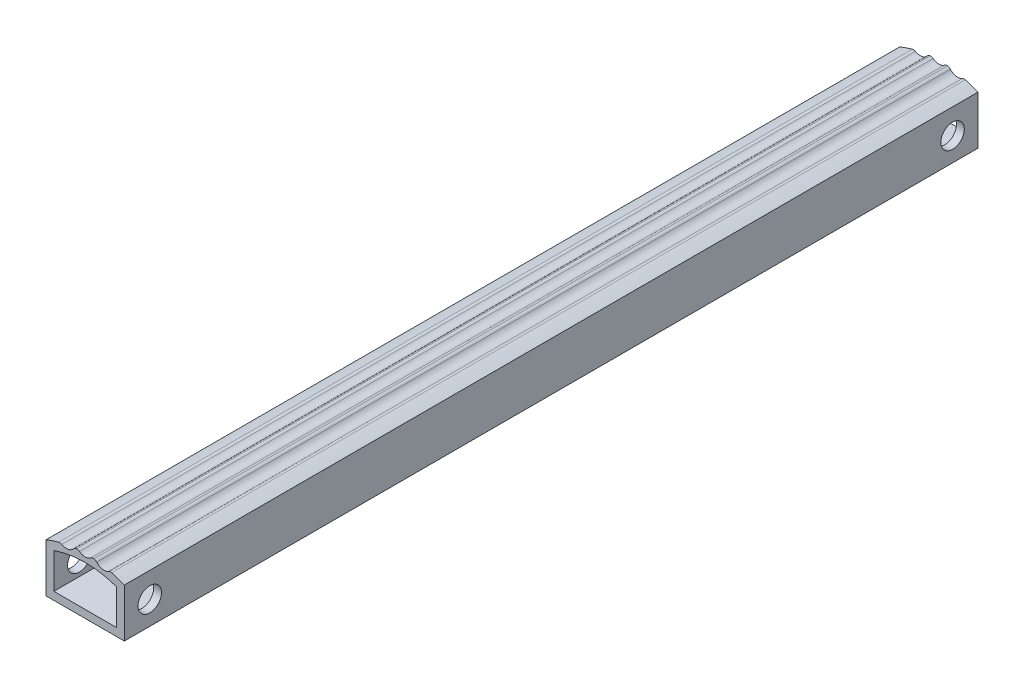
ISO-10303-21;
HEADER;
FILE_DESCRIPTION(('STEP AP214'),'2;1');
FILE_NAME('part.step','',(''),(''),'','','');
FILE_SCHEMA(('AUTOMOTIVE_DESIGN { 1 0 10303 214 1 1 1 1 }'));
ENDSEC;
DATA;
#1=APPLICATION_CONTEXT('core data for automotive mechanical design processes');
#2=APPLICATION_PROTOCOL_DEFINITION('international standard','automotive_design',2000,#1);
#3=PRODUCT_CONTEXT('',#1,'mechanical');
#4=PRODUCT('Part','Part','',(#3));
#5=PRODUCT_RELATED_PRODUCT_CATEGORY('part','',(#4));
#6=PRODUCT_DEFINITION_FORMATION('','',#4);
#7=PRODUCT_DEFINITION_CONTEXT('part definition',#1,'design');
#8=PRODUCT_DEFINITION('design','',#6,#7);
#9=PRODUCT_DEFINITION_SHAPE('','',#8);
#10=(LENGTH_UNIT() NAMED_UNIT(*) SI_UNIT(.MILLI.,.METRE.));
#11=(NAMED_UNIT(*) PLANE_ANGLE_UNIT() SI_UNIT($,.RADIAN.));
#12=(NAMED_UNIT(*) SI_UNIT($,.STERADIAN.) SOLID_ANGLE_UNIT());
#13=UNCERTAINTY_MEASURE_WITH_UNIT(LENGTH_MEASURE(1.E-05),#10,'distance_accuracy_value','');
#14=(GEOMETRIC_REPRESENTATION_CONTEXT(3) GLOBAL_UNCERTAINTY_ASSIGNED_CONTEXT((#13)) GLOBAL_UNIT_ASSIGNED_CONTEXT((#10,
#11,#12)) REPRESENTATION_CONTEXT('',''));
#15=CARTESIAN_POINT('',(0.,0.,0.));
#16=DIRECTION('',(0.,0.,1.));
#17=DIRECTION('',(1.,0.,0.));
#18=AXIS2_PLACEMENT_3D('',#15,#16,#17);
#19=CARTESIAN_POINT('',(0.,-5.8,54.5));
#20=DIRECTION('',(0.,0.,1.));
#21=DIRECTION('',(1.,0.,0.));
#22=AXIS2_PLACEMENT_3D('',#19,#20,#21);
#23=PLANE('',#22);
#24=DIRECTION('',(0.,-1.,0.));
#25=VECTOR('',#24,1.);
#26=CARTESIAN_POINT('',(-5.,0.,54.5));
#27=LINE('',#26,#25);
#28=CARTESIAN_POINT('',(-5.,6.2,54.5));
#29=VERTEX_POINT('',#28);
#30=CARTESIAN_POINT('',(-5.,0.,54.5));
#31=VERTEX_POINT('',#30);
#32=EDGE_CURVE('E209',#29,#31,#27,.T.);
#33=ORIENTED_EDGE('',*,*,#32,.T.);
#34=DIRECTION('',(1.,0.,0.));
#35=VECTOR('',#34,1.);
#36=CARTESIAN_POINT('',(-5.,0.,54.5));
#37=LINE('',#36,#35);
#38=CARTESIAN_POINT('',(5.,0.,54.5));
#39=VERTEX_POINT('',#38);
#40=EDGE_CURVE('E212',#31,#39,#37,.T.);
#41=ORIENTED_EDGE('',*,*,#40,.T.);
#42=DIRECTION('',(0.,1.,0.));
#43=VECTOR('',#42,1.);
#44=CARTESIAN_POINT('',(5.,0.,54.5));
#45=LINE('',#44,#43);
#46=CARTESIAN_POINT('',(5.,6.2,54.5));
#47=VERTEX_POINT('',#46);
#48=EDGE_CURVE('E215',#39,#47,#45,.T.);
#49=ORIENTED_EDGE('',*,*,#48,.T.);
#50=CARTESIAN_POINT('',(0.,-5.8,54.5));
#51=DIRECTION('',(0.,0.,1.));
#52=DIRECTION('',(1.,0.,0.));
#53=AXIS2_PLACEMENT_3D('',#50,#51,#52);
#54=CIRCLE('',#53,13.);
#55=CARTESIAN_POINT('',(3.37851103714552,6.75331283653386,54.5));
#56=VERTEX_POINT('',#55);
#57=EDGE_CURVE('E217',#47,#56,#54,.T.);
#58=ORIENTED_EDGE('',*,*,#57,.T.);
#59=CARTESIAN_POINT('',(3.24856830494762,6.27049311205179,54.5));
#60=DIRECTION('',(0.,0.,1.));
#61=DIRECTION('',(-1.,0.,0.));
#62=AXIS2_PLACEMENT_3D('',#59,#60,#61);
#63=CIRCLE('',#62,0.5);
#64=CARTESIAN_POINT('',(2.99745317631393,6.70286007676035,54.5));
#65=VERTEX_POINT('',#64);
#66=EDGE_CURVE('E219',#56,#65,#63,.T.);
#67=ORIENTED_EDGE('',*,*,#66,.T.);
#68=CARTESIAN_POINT('',(2.39477686759309,7.74054079206089,54.5));
#69=DIRECTION('',(0.,0.,-1.));
#70=DIRECTION('',(1.,0.,0.));
#71=AXIS2_PLACEMENT_3D('',#68,#69,#70);
#72=CIRCLE('',#71,1.20000000000001);
#73=CARTESIAN_POINT('',(1.47274455826341,6.9725196852206,54.5));
#74=VERTEX_POINT('',#73);
#75=EDGE_CURVE('E221',#65,#74,#72,.T.);
#76=ORIENTED_EDGE('',*,*,#75,.T.);
#77=CARTESIAN_POINT('',(1.08856442937604,6.65251089070382,54.5));
#78=DIRECTION('',(0.,0.,1.));
#79=DIRECTION('',(1.,0.,0.));
#80=AXIS2_PLACEMENT_3D('',#77,#78,#79);
#81=CIRCLE('',#80,0.5);
#82=CARTESIAN_POINT('',(1.13210700655108,7.15061132633197,54.5));
#83=VERTEX_POINT('',#82);
#84=EDGE_CURVE('E223',#74,#83,#81,.T.);
#85=ORIENTED_EDGE('',*,*,#84,.T.);
#86=CARTESIAN_POINT('',(0.,-5.8,54.5));
#87=DIRECTION('',(0.,0.,1.));
#88=DIRECTION('',(1.,0.,0.));
#89=AXIS2_PLACEMENT_3D('',#86,#87,#88);
#90=CIRCLE('',#89,13.);
#91=CARTESIAN_POINT('',(1.08333169502081,7.15478260869565,54.5));
#92=VERTEX_POINT('',#91);
#93=EDGE_CURVE('E225',#83,#92,#90,.T.);
#94=ORIENTED_EDGE('',*,*,#93,.T.);
#95=CARTESIAN_POINT('',(1.04166509136617,6.65652173913044,54.5));
#96=DIRECTION('',(0.,0.,1.));
#97=DIRECTION('',(-1.,0.,0.));
#98=AXIS2_PLACEMENT_3D('',#95,#96,#97);
#99=CIRCLE('',#98,0.5);
#100=CARTESIAN_POINT('',(0.735293005670237,7.05166240409207,54.5));
#101=VERTEX_POINT('',#100);
#102=EDGE_CURVE('E227',#92,#101,#99,.T.);
#103=ORIENTED_EDGE('',*,*,#102,.T.);
#104=CARTESIAN_POINT('',(0.,8.,54.5));
#105=DIRECTION('',(0.,0.,-1.));
#106=DIRECTION('',(1.,0.,0.));
#107=AXIS2_PLACEMENT_3D('',#104,#105,#106);
#108=CIRCLE('',#107,1.2);
#109=CARTESIAN_POINT('',(-0.735293005670238,7.05166240409207,54.5));
#110=VERTEX_POINT('',#109);
#111=EDGE_CURVE('E229',#101,#110,#108,.T.);
#112=ORIENTED_EDGE('',*,*,#111,.T.);
#113=CARTESIAN_POINT('',(-1.04166509136617,6.65652173913044,54.5));
#114=DIRECTION('',(0.,0.,1.));
#115=DIRECTION('',(1.,0.,0.));
#116=AXIS2_PLACEMENT_3D('',#113,#114,#115);
#117=CIRCLE('',#116,0.5);
#118=CARTESIAN_POINT('',(-1.08333169502082,7.15478260869565,54.5));
#119=VERTEX_POINT('',#118);
#120=EDGE_CURVE('E231',#110,#119,#117,.T.);
#121=ORIENTED_EDGE('',*,*,#120,.T.);
#122=CARTESIAN_POINT('',(0.,-5.8,54.5));
#123=DIRECTION('',(0.,0.,1.));
#124=DIRECTION('',(1.,0.,0.));
#125=AXIS2_PLACEMENT_3D('',#122,#123,#124);
#126=CIRCLE('',#125,13.);
#127=CARTESIAN_POINT('',(-1.13210700655108,7.15061132633197,54.5));
#128=VERTEX_POINT('',#127);
#129=EDGE_CURVE('E233',#119,#128,#126,.T.);
#130=ORIENTED_EDGE('',*,*,#129,.T.);
#131=CARTESIAN_POINT('',(-1.08856442937604,6.65251089070382,54.5));
#132=DIRECTION('',(0.,0.,1.));
#133=DIRECTION('',(-1.,0.,0.));
#134=AXIS2_PLACEMENT_3D('',#131,#132,#133);
#135=CIRCLE('',#134,0.5);
#136=CARTESIAN_POINT('',(-1.47274455826341,6.9725196852206,54.5));
#137=VERTEX_POINT('',#136);
#138=EDGE_CURVE('E235',#128,#137,#135,.T.);
#139=ORIENTED_EDGE('',*,*,#138,.T.);
#140=CARTESIAN_POINT('',(-2.39477686759309,7.74054079206089,54.5));
#141=DIRECTION('',(0.,0.,-1.));
#142=DIRECTION('',(-1.,0.,0.));
#143=AXIS2_PLACEMENT_3D('',#140,#141,#142);
#144=CIRCLE('',#143,1.20000000000001);
#145=CARTESIAN_POINT('',(-2.99745317631393,6.70286007676035,54.5));
#146=VERTEX_POINT('',#145);
#147=EDGE_CURVE('E237',#137,#146,#144,.T.);
#148=ORIENTED_EDGE('',*,*,#147,.T.);
#149=CARTESIAN_POINT('',(-3.24856830494762,6.27049311205179,54.5));
#150=DIRECTION('',(0.,0.,1.));
#151=DIRECTION('',(1.,0.,0.));
#152=AXIS2_PLACEMENT_3D('',#149,#150,#151);
#153=CIRCLE('',#152,0.5);
#154=CARTESIAN_POINT('',(-3.37851103714552,6.75331283653386,54.5));
#155=VERTEX_POINT('',#154);
#156=EDGE_CURVE('E239',#146,#155,#153,.T.);
#157=ORIENTED_EDGE('',*,*,#156,.T.);
#158=CARTESIAN_POINT('',(0.,-5.8,54.5));
#159=DIRECTION('',(0.,0.,1.));
#160=DIRECTION('',(1.,0.,0.));
#161=AXIS2_PLACEMENT_3D('',#158,#159,#160);
#162=CIRCLE('',#161,13.);
#163=EDGE_CURVE('E241',#155,#29,#162,.T.);
#164=ORIENTED_EDGE('',*,*,#163,.T.);
#165=EDGE_LOOP('',(#33,#41,#49,#58,#67,#76,#85,#94,#103,#112,#121,#130,#139,#148,#157,#164));
#166=FACE_BOUND('',#165,.T.);
#167=DIRECTION('',(0.,1.,0.));
#168=VECTOR('',#167,1.);
#169=CARTESIAN_POINT('',(4.,1.,54.5));
#170=LINE('',#169,#168);
#171=CARTESIAN_POINT('',(4.,1.,54.5));
#172=VERTEX_POINT('',#171);
#173=CARTESIAN_POINT('',(4.,5.51370849898476,54.5));
#174=VERTEX_POINT('',#173);
#175=EDGE_CURVE('E179',#172,#174,#170,.T.);
#176=ORIENTED_EDGE('',*,*,#175,.F.);
#177=DIRECTION('',(1.,0.,0.));
#178=VECTOR('',#177,1.);
#179=CARTESIAN_POINT('',(-4.,1.,54.5));
#180=LINE('',#179,#178);
#181=CARTESIAN_POINT('',(-4.,1.,54.5));
#182=VERTEX_POINT('',#181);
#183=EDGE_CURVE('E171',#182,#172,#180,.T.);
#184=ORIENTED_EDGE('',*,*,#183,.F.);
#185=DIRECTION('',(0.,-1.,0.));
#186=VECTOR('',#185,1.);
#187=CARTESIAN_POINT('',(-4.,1.,54.5));
#188=LINE('',#187,#186);
#189=CARTESIAN_POINT('',(-4.,5.51370849898476,54.5));
#190=VERTEX_POINT('',#189);
#191=EDGE_CURVE('E193',#190,#182,#188,.T.);
#192=ORIENTED_EDGE('',*,*,#191,.F.);
#193=CARTESIAN_POINT('',(0.,-5.8,54.5));
#194=DIRECTION('',(0.,0.,1.));
#195=DIRECTION('',(1.,0.,0.));
#196=AXIS2_PLACEMENT_3D('',#193,#194,#195);
#197=CIRCLE('',#196,12.);
#198=EDGE_CURVE('E191',#174,#190,#197,.T.);
#199=ORIENTED_EDGE('',*,*,#198,.F.);
#200=EDGE_LOOP('',(#176,#184,#192,#199));
#201=FACE_BOUND('',#200,.T.);
#202=ADVANCED_FACE('F32',(#166,#201),#23,.T.);
#203=CARTESIAN_POINT('',(0.,-5.8,-54.5));
#204=DIRECTION('',(0.,0.,1.));
#205=DIRECTION('',(1.,0.,0.));
#206=AXIS2_PLACEMENT_3D('',#203,#204,#205);
#207=PLANE('',#206);
#208=DIRECTION('',(0.,-1.,0.));
#209=VECTOR('',#208,1.);
#210=CARTESIAN_POINT('',(-5.,0.,-54.5));
#211=LINE('',#210,#209);
#212=CARTESIAN_POINT('',(-5.,6.2,-54.5));
#213=VERTEX_POINT('',#212);
#214=CARTESIAN_POINT('',(-5.,0.,-54.5));
#215=VERTEX_POINT('',#214);
#216=EDGE_CURVE('E187',#213,#215,#211,.T.);
#217=ORIENTED_EDGE('',*,*,#216,.F.);
#218=CARTESIAN_POINT('',(0.,-5.8,-54.5));
#219=DIRECTION('',(0.,0.,1.));
#220=DIRECTION('',(1.,0.,0.));
#221=AXIS2_PLACEMENT_3D('',#218,#219,#220);
#222=CIRCLE('',#221,13.);
#223=CARTESIAN_POINT('',(-3.37851103714552,6.75331283653386,-54.5));
#224=VERTEX_POINT('',#223);
#225=EDGE_CURVE('E213',#224,#213,#222,.T.);
#226=ORIENTED_EDGE('',*,*,#225,.F.);
#227=CARTESIAN_POINT('',(-3.24856830494762,6.27049311205179,-54.5));
#228=DIRECTION('',(0.,0.,1.));
#229=DIRECTION('',(1.,0.,0.));
#230=AXIS2_PLACEMENT_3D('',#227,#228,#229);
#231=CIRCLE('',#230,0.5);
#232=CARTESIAN_POINT('',(-2.99745317631393,6.70286007676035,-54.5));
#233=VERTEX_POINT('',#232);
#234=EDGE_CURVE('E272',#233,#224,#231,.T.);
#235=ORIENTED_EDGE('',*,*,#234,.F.);
#236=CARTESIAN_POINT('',(-2.39477686759309,7.74054079206089,-54.5));
#237=DIRECTION('',(0.,0.,-1.));
#238=DIRECTION('',(-1.,0.,0.));
#239=AXIS2_PLACEMENT_3D('',#236,#237,#238);
#240=CIRCLE('',#239,1.20000000000001);
#241=CARTESIAN_POINT('',(-1.47274455826341,6.9725196852206,-54.5));
#242=VERTEX_POINT('',#241);
#243=EDGE_CURVE('E270',#242,#233,#240,.T.);
#244=ORIENTED_EDGE('',*,*,#243,.F.);
#245=CARTESIAN_POINT('',(-1.08856442937604,6.65251089070382,-54.5));
#246=DIRECTION('',(0.,0.,1.));
#247=DIRECTION('',(-1.,0.,0.));
#248=AXIS2_PLACEMENT_3D('',#245,#246,#247);
#249=CIRCLE('',#248,0.5);
#250=CARTESIAN_POINT('',(-1.13210700655108,7.15061132633197,-54.5));
#251=VERTEX_POINT('',#250);
#252=EDGE_CURVE('E268',#251,#242,#249,.T.);
#253=ORIENTED_EDGE('',*,*,#252,.F.);
#254=CARTESIAN_POINT('',(0.,-5.8,-54.5));
#255=DIRECTION('',(0.,0.,1.));
#256=DIRECTION('',(1.,0.,0.));
#257=AXIS2_PLACEMENT_3D('',#254,#255,#256);
#258=CIRCLE('',#257,13.);
#259=CARTESIAN_POINT('',(-1.08333169502082,7.15478260869565,-54.5));
#260=VERTEX_POINT('',#259);
#261=EDGE_CURVE('E266',#260,#251,#258,.T.);
#262=ORIENTED_EDGE('',*,*,#261,.F.);
#263=CARTESIAN_POINT('',(-1.04166509136617,6.65652173913044,-54.5));
#264=DIRECTION('',(0.,0.,1.));
#265=DIRECTION('',(1.,0.,0.));
#266=AXIS2_PLACEMENT_3D('',#263,#264,#265);
#267=CIRCLE('',#266,0.5);
#268=CARTESIAN_POINT('',(-0.735293005670238,7.05166240409207,-54.5));
#269=VERTEX_POINT('',#268);
#270=EDGE_CURVE('E264',#269,#260,#267,.T.);
#271=ORIENTED_EDGE('',*,*,#270,.F.);
#272=CARTESIAN_POINT('',(0.,8.,-54.5));
#273=DIRECTION('',(0.,0.,-1.));
#274=DIRECTION('',(1.,0.,0.));
#275=AXIS2_PLACEMENT_3D('',#272,#273,#274);
#276=CIRCLE('',#275,1.2);
#277=CARTESIAN_POINT('',(0.735293005670237,7.05166240409207,-54.5));
#278=VERTEX_POINT('',#277);
#279=EDGE_CURVE('E262',#278,#269,#276,.T.);
#280=ORIENTED_EDGE('',*,*,#279,.F.);
#281=CARTESIAN_POINT('',(1.04166509136617,6.65652173913044,-54.5));
#282=DIRECTION('',(0.,0.,1.));
#283=DIRECTION('',(-1.,0.,0.));
#284=AXIS2_PLACEMENT_3D('',#281,#282,#283);
#285=CIRCLE('',#284,0.5);
#286=CARTESIAN_POINT('',(1.08333169502081,7.15478260869565,-54.5));
#287=VERTEX_POINT('',#286);
#288=EDGE_CURVE('E260',#287,#278,#285,.T.);
#289=ORIENTED_EDGE('',*,*,#288,.F.);
#290=CARTESIAN_POINT('',(0.,-5.8,-54.5));
#291=DIRECTION('',(0.,0.,1.));
#292=DIRECTION('',(1.,0.,0.));
#293=AXIS2_PLACEMENT_3D('',#290,#291,#292);
#294=CIRCLE('',#293,13.);
#295=CARTESIAN_POINT('',(1.13210700655108,7.15061132633197,-54.5));
#296=VERTEX_POINT('',#295);
#297=EDGE_CURVE('E258',#296,#287,#294,.T.);
#298=ORIENTED_EDGE('',*,*,#297,.F.);
#299=CARTESIAN_POINT('',(1.08856442937604,6.65251089070382,-54.5));
#300=DIRECTION('',(0.,0.,1.));
#301=DIRECTION('',(1.,0.,0.));
#302=AXIS2_PLACEMENT_3D('',#299,#300,#301);
#303=CIRCLE('',#302,0.5);
#304=CARTESIAN_POINT('',(1.47274455826341,6.9725196852206,-54.5));
#305=VERTEX_POINT('',#304);
#306=EDGE_CURVE('E256',#305,#296,#303,.T.);
#307=ORIENTED_EDGE('',*,*,#306,.F.);
#308=CARTESIAN_POINT('',(2.39477686759309,7.74054079206089,-54.5));
#309=DIRECTION('',(0.,0.,-1.));
#310=DIRECTION('',(1.,0.,0.));
#311=AXIS2_PLACEMENT_3D('',#308,#309,#310);
#312=CIRCLE('',#311,1.20000000000001);
#313=CARTESIAN_POINT('',(2.99745317631393,6.70286007676035,-54.5));
#314=VERTEX_POINT('',#313);
#315=EDGE_CURVE('E254',#314,#305,#312,.T.);
#316=ORIENTED_EDGE('',*,*,#315,.F.);
#317=CARTESIAN_POINT('',(3.24856830494762,6.27049311205179,-54.5));
#318=DIRECTION('',(0.,0.,1.));
#319=DIRECTION('',(-1.,0.,0.));
#320=AXIS2_PLACEMENT_3D('',#317,#318,#319);
#321=CIRCLE('',#320,0.5);
#322=CARTESIAN_POINT('',(3.37851103714552,6.75331283653386,-54.5));
#323=VERTEX_POINT('',#322);
#324=EDGE_CURVE('E252',#323,#314,#321,.T.);
#325=ORIENTED_EDGE('',*,*,#324,.F.);
#326=CARTESIAN_POINT('',(0.,-5.8,-54.5));
#327=DIRECTION('',(0.,0.,1.));
#328=DIRECTION('',(1.,0.,0.));
#329=AXIS2_PLACEMENT_3D('',#326,#327,#328);
#330=CIRCLE('',#329,13.);
#331=CARTESIAN_POINT('',(5.,6.2,-54.5));
#332=VERTEX_POINT('',#331);
#333=EDGE_CURVE('E250',#332,#323,#330,.T.);
#334=ORIENTED_EDGE('',*,*,#333,.F.);
#335=DIRECTION('',(0.,1.,0.));
#336=VECTOR('',#335,1.);
#337=CARTESIAN_POINT('',(5.,0.,-54.5));
#338=LINE('',#337,#336);
#339=CARTESIAN_POINT('',(5.,0.,-54.5));
#340=VERTEX_POINT('',#339);
#341=EDGE_CURVE('E248',#340,#332,#338,.T.);
#342=ORIENTED_EDGE('',*,*,#341,.F.);
#343=DIRECTION('',(1.,0.,0.));
#344=VECTOR('',#343,1.);
#345=CARTESIAN_POINT('',(-5.,0.,-54.5));
#346=LINE('',#345,#344);
#347=EDGE_CURVE('E246',#215,#340,#346,.T.);
#348=ORIENTED_EDGE('',*,*,#347,.F.);
#349=EDGE_LOOP('',(#217,#226,#235,#244,#253,#262,#271,#280,#289,#298,#307,#316,#325,#334,#342,#348));
#350=FACE_BOUND('',#349,.T.);
#351=DIRECTION('',(1.,0.,0.));
#352=VECTOR('',#351,1.);
#353=CARTESIAN_POINT('',(-4.,1.,-54.5));
#354=LINE('',#353,#352);
#355=CARTESIAN_POINT('',(-4.,1.,-54.5));
#356=VERTEX_POINT('',#355);
#357=CARTESIAN_POINT('',(4.,1.,-54.5));
#358=VERTEX_POINT('',#357);
#359=EDGE_CURVE('E57',#356,#358,#354,.T.);
#360=ORIENTED_EDGE('',*,*,#359,.T.);
#361=DIRECTION('',(0.,1.,0.));
#362=VECTOR('',#361,1.);
#363=CARTESIAN_POINT('',(4.,1.,-54.5));
#364=LINE('',#363,#362);
#365=CARTESIAN_POINT('',(4.,5.51370849898476,-54.5));
#366=VERTEX_POINT('',#365);
#367=EDGE_CURVE('E186',#358,#366,#364,.T.);
#368=ORIENTED_EDGE('',*,*,#367,.T.);
#369=CARTESIAN_POINT('',(0.,-5.8,-54.5));
#370=DIRECTION('',(0.,0.,1.));
#371=DIRECTION('',(1.,0.,0.));
#372=AXIS2_PLACEMENT_3D('',#369,#370,#371);
#373=CIRCLE('',#372,12.);
#374=CARTESIAN_POINT('',(-4.,5.51370849898476,-54.5));
#375=VERTEX_POINT('',#374);
#376=EDGE_CURVE('E201',#366,#375,#373,.T.);
#377=ORIENTED_EDGE('',*,*,#376,.T.);
#378=DIRECTION('',(0.,-1.,0.));
#379=VECTOR('',#378,1.);
#380=CARTESIAN_POINT('',(-4.,1.,-54.5));
#381=LINE('',#380,#379);
#382=EDGE_CURVE('E180',#375,#356,#381,.T.);
#383=ORIENTED_EDGE('',*,*,#382,.T.);
#384=EDGE_LOOP('',(#360,#368,#377,#383));
#385=FACE_BOUND('',#384,.T.);
#386=ADVANCED_FACE('F355',(#350,#385),#207,.F.);
#387=CARTESIAN_POINT('',(-5.,0.,54.5));
#388=DIRECTION('',(1.,0.,0.));
#389=DIRECTION('',(0.,0.,-1.));
#390=AXIS2_PLACEMENT_3D('',#387,#388,#389);
#391=PLANE('',#390);
#392=CARTESIAN_POINT('',(-5.,3.00000000000003,51.25));
#393=DIRECTION('',(-1.,0.,0.));
#394=DIRECTION('',(0.,0.,1.));
#395=AXIS2_PLACEMENT_3D('',#392,#393,#394);
#396=CIRCLE('',#395,1.5);
#397=CARTESIAN_POINT('',(-5.,3.00000000000003,52.75));
#398=VERTEX_POINT('',#397);
#399=EDGE_CURVE('E334',#398,#398,#396,.T.);
#400=ORIENTED_EDGE('',*,*,#399,.F.);
#401=EDGE_LOOP('',(#400));
#402=FACE_BOUND('',#401,.T.);
#403=CARTESIAN_POINT('',(-5.,3.,-51.25));
#404=DIRECTION('',(-1.,0.,0.));
#405=DIRECTION('',(0.,0.,1.));
#406=AXIS2_PLACEMENT_3D('',#403,#404,#405);
#407=CIRCLE('',#406,1.5);
#408=CARTESIAN_POINT('',(-5.,3.,-49.75));
#409=VERTEX_POINT('',#408);
#410=EDGE_CURVE('E324',#409,#409,#407,.T.);
#411=ORIENTED_EDGE('',*,*,#410,.F.);
#412=EDGE_LOOP('',(#411));
#413=FACE_BOUND('',#412,.T.);
#414=ORIENTED_EDGE('',*,*,#216,.T.);
#415=DIRECTION('',(0.,0.,-1.));
#416=VECTOR('',#415,1.);
#417=CARTESIAN_POINT('',(-5.,0.,54.5));
#418=LINE('',#417,#416);
#419=EDGE_CURVE('E11',#31,#215,#418,.T.);
#420=ORIENTED_EDGE('',*,*,#419,.F.);
#421=ORIENTED_EDGE('',*,*,#32,.F.);
#422=DIRECTION('',(0.,0.,-1.));
#423=VECTOR('',#422,1.);
#424=CARTESIAN_POINT('',(-5.,6.2,54.5));
#425=LINE('',#424,#423);
#426=EDGE_CURVE('E243',#29,#213,#425,.T.);
#427=ORIENTED_EDGE('',*,*,#426,.T.);
#428=EDGE_LOOP('',(#414,#420,#421,#427));
#429=FACE_BOUND('',#428,.T.);
#430=ADVANCED_FACE('F34',(#402,#413,#429),#391,.F.);
#431=CARTESIAN_POINT('',(-5.,0.,54.5));
#432=DIRECTION('',(0.,1.,0.));
#433=DIRECTION('',(0.,0.,1.));
#434=AXIS2_PLACEMENT_3D('',#431,#432,#433);
#435=PLANE('',#434);
#436=ORIENTED_EDGE('',*,*,#347,.T.);
#437=DIRECTION('',(0.,0.,-1.));
#438=VECTOR('',#437,1.);
#439=CARTESIAN_POINT('',(5.,0.,54.5));
#440=LINE('',#439,#438);
#441=EDGE_CURVE('E41',#39,#340,#440,.T.);
#442=ORIENTED_EDGE('',*,*,#441,.F.);
#443=ORIENTED_EDGE('',*,*,#40,.F.);
#444=ORIENTED_EDGE('',*,*,#419,.T.);
#445=EDGE_LOOP('',(#436,#442,#443,#444));
#446=FACE_BOUND('',#445,.T.);
#447=ADVANCED_FACE('F428',(#446),#435,.F.);
#448=CARTESIAN_POINT('',(5.,0.,54.5));
#449=DIRECTION('',(-1.,0.,0.));
#450=DIRECTION('',(0.,0.,1.));
#451=AXIS2_PLACEMENT_3D('',#448,#449,#450);
#452=PLANE('',#451);
#453=CARTESIAN_POINT('',(5.,3.00000000000003,51.25));
#454=DIRECTION('',(-1.,0.,0.));
#455=DIRECTION('',(0.,0.,1.));
#456=AXIS2_PLACEMENT_3D('',#453,#454,#455);
#457=CIRCLE('',#456,1.5);
#458=CARTESIAN_POINT('',(5.,3.00000000000003,52.75));
#459=VERTEX_POINT('',#458);
#460=EDGE_CURVE('E337',#459,#459,#457,.T.);
#461=ORIENTED_EDGE('',*,*,#460,.T.);
#462=EDGE_LOOP('',(#461));
#463=FACE_BOUND('',#462,.T.);
#464=CARTESIAN_POINT('',(5.,3.,-51.25));
#465=DIRECTION('',(-1.,0.,0.));
#466=DIRECTION('',(0.,0.,1.));
#467=AXIS2_PLACEMENT_3D('',#464,#465,#466);
#468=CIRCLE('',#467,1.5);
#469=CARTESIAN_POINT('',(5.,3.,-49.75));
#470=VERTEX_POINT('',#469);
#471=EDGE_CURVE('E319',#470,#470,#468,.T.);
#472=ORIENTED_EDGE('',*,*,#471,.T.);
#473=EDGE_LOOP('',(#472));
#474=FACE_BOUND('',#473,.T.);
#475=ORIENTED_EDGE('',*,*,#341,.T.);
#476=DIRECTION('',(0.,0.,-1.));
#477=VECTOR('',#476,1.);
#478=CARTESIAN_POINT('',(5.,6.2,54.5));
#479=LINE('',#478,#477);
#480=EDGE_CURVE('E313',#47,#332,#479,.T.);
#481=ORIENTED_EDGE('',*,*,#480,.F.);
#482=ORIENTED_EDGE('',*,*,#48,.F.);
#483=ORIENTED_EDGE('',*,*,#441,.T.);
#484=EDGE_LOOP('',(#475,#481,#482,#483));
#485=FACE_BOUND('',#484,.T.);
#486=ADVANCED_FACE('F425',(#463,#474,#485),#452,.F.);
#487=CARTESIAN_POINT('',(0.,-5.8,54.5));
#488=DIRECTION('',(0.,0.,-1.));
#489=DIRECTION('',(-1.,0.,0.));
#490=AXIS2_PLACEMENT_3D('',#487,#488,#489);
#491=CYLINDRICAL_SURFACE('',#490,13.);
#492=ORIENTED_EDGE('',*,*,#333,.T.);
#493=DIRECTION('',(0.,0.,-1.));
#494=VECTOR('',#493,1.);
#495=CARTESIAN_POINT('',(3.37851103714552,6.75331283653386,54.5));
#496=LINE('',#495,#494);
#497=EDGE_CURVE('E310',#56,#323,#496,.T.);
#498=ORIENTED_EDGE('',*,*,#497,.F.);
#499=ORIENTED_EDGE('',*,*,#57,.F.);
#500=ORIENTED_EDGE('',*,*,#480,.T.);
#501=EDGE_LOOP('',(#492,#498,#499,#500));
#502=FACE_BOUND('',#501,.T.);
#503=ADVANCED_FACE('F421',(#502),#491,.T.);
#504=CARTESIAN_POINT('',(3.24856830494762,6.27049311205179,54.5));
#505=DIRECTION('',(0.,0.,-1.));
#506=DIRECTION('',(-1.,0.,0.));
#507=AXIS2_PLACEMENT_3D('',#504,#505,#506);
#508=CYLINDRICAL_SURFACE('',#507,0.5);
#509=ORIENTED_EDGE('',*,*,#324,.T.);
#510=DIRECTION('',(0.,0.,-1.));
#511=VECTOR('',#510,1.);
#512=CARTESIAN_POINT('',(2.99745317631393,6.70286007676035,54.5));
#513=LINE('',#512,#511);
#514=EDGE_CURVE('E307',#65,#314,#513,.T.);
#515=ORIENTED_EDGE('',*,*,#514,.F.);
#516=ORIENTED_EDGE('',*,*,#66,.F.);
#517=ORIENTED_EDGE('',*,*,#497,.T.);
#518=EDGE_LOOP('',(#509,#515,#516,#517));
#519=FACE_BOUND('',#518,.T.);
#520=ADVANCED_FACE('F417',(#519),#508,.T.);
#521=CARTESIAN_POINT('',(2.39477686759309,7.74054079206089,54.5));
#522=DIRECTION('',(0.,0.,-1.));
#523=DIRECTION('',(-1.,0.,0.));
#524=AXIS2_PLACEMENT_3D('',#521,#522,#523);
#525=CYLINDRICAL_SURFACE('',#524,1.20000000000001);
#526=ORIENTED_EDGE('',*,*,#315,.T.);
#527=DIRECTION('',(0.,0.,-1.));
#528=VECTOR('',#527,1.);
#529=CARTESIAN_POINT('',(1.47274455826341,6.9725196852206,54.5));
#530=LINE('',#529,#528);
#531=EDGE_CURVE('E304',#74,#305,#530,.T.);
#532=ORIENTED_EDGE('',*,*,#531,.F.);
#533=ORIENTED_EDGE('',*,*,#75,.F.);
#534=ORIENTED_EDGE('',*,*,#514,.T.);
#535=EDGE_LOOP('',(#526,#532,#533,#534));
#536=FACE_BOUND('',#535,.T.);
#537=ADVANCED_FACE('F413',(#536),#525,.F.);
#538=CARTESIAN_POINT('',(1.08856442937604,6.65251089070382,54.5));
#539=DIRECTION('',(0.,0.,-1.));
#540=DIRECTION('',(-1.,0.,0.));
#541=AXIS2_PLACEMENT_3D('',#538,#539,#540);
#542=CYLINDRICAL_SURFACE('',#541,0.5);
#543=ORIENTED_EDGE('',*,*,#306,.T.);
#544=DIRECTION('',(0.,0.,-1.));
#545=VECTOR('',#544,1.);
#546=CARTESIAN_POINT('',(1.13210700655108,7.15061132633197,54.5));
#547=LINE('',#546,#545);
#548=EDGE_CURVE('E301',#83,#296,#547,.T.);
#549=ORIENTED_EDGE('',*,*,#548,.F.);
#550=ORIENTED_EDGE('',*,*,#84,.F.);
#551=ORIENTED_EDGE('',*,*,#531,.T.);
#552=EDGE_LOOP('',(#543,#549,#550,#551));
#553=FACE_BOUND('',#552,.T.);
#554=ADVANCED_FACE('F409',(#553),#542,.T.);
#555=CARTESIAN_POINT('',(0.,-5.8,54.5));
#556=DIRECTION('',(0.,0.,-1.));
#557=DIRECTION('',(-1.,0.,0.));
#558=AXIS2_PLACEMENT_3D('',#555,#556,#557);
#559=CYLINDRICAL_SURFACE('',#558,13.);
#560=ORIENTED_EDGE('',*,*,#297,.T.);
#561=DIRECTION('',(0.,0.,-1.));
#562=VECTOR('',#561,1.);
#563=CARTESIAN_POINT('',(1.08333169502081,7.15478260869565,54.5));
#564=LINE('',#563,#562);
#565=EDGE_CURVE('E298',#92,#287,#564,.T.);
#566=ORIENTED_EDGE('',*,*,#565,.F.);
#567=ORIENTED_EDGE('',*,*,#93,.F.);
#568=ORIENTED_EDGE('',*,*,#548,.T.);
#569=EDGE_LOOP('',(#560,#566,#567,#568));
#570=FACE_BOUND('',#569,.T.);
#571=ADVANCED_FACE('F405',(#570),#559,.T.);
#572=CARTESIAN_POINT('',(1.04166509136617,6.65652173913044,54.5));
#573=DIRECTION('',(0.,0.,-1.));
#574=DIRECTION('',(-1.,0.,0.));
#575=AXIS2_PLACEMENT_3D('',#572,#573,#574);
#576=CYLINDRICAL_SURFACE('',#575,0.5);
#577=ORIENTED_EDGE('',*,*,#288,.T.);
#578=DIRECTION('',(0.,0.,-1.));
#579=VECTOR('',#578,1.);
#580=CARTESIAN_POINT('',(0.735293005670237,7.05166240409207,54.5));
#581=LINE('',#580,#579);
#582=EDGE_CURVE('E295',#101,#278,#581,.T.);
#583=ORIENTED_EDGE('',*,*,#582,.F.);
#584=ORIENTED_EDGE('',*,*,#102,.F.);
#585=ORIENTED_EDGE('',*,*,#565,.T.);
#586=EDGE_LOOP('',(#577,#583,#584,#585));
#587=FACE_BOUND('',#586,.T.);
#588=ADVANCED_FACE('F401',(#587),#576,.T.);
#589=CARTESIAN_POINT('',(0.,8.,54.5));
#590=DIRECTION('',(0.,0.,-1.));
#591=DIRECTION('',(-1.,0.,0.));
#592=AXIS2_PLACEMENT_3D('',#589,#590,#591);
#593=CYLINDRICAL_SURFACE('',#592,1.2);
#594=ORIENTED_EDGE('',*,*,#279,.T.);
#595=DIRECTION('',(0.,0.,-1.));
#596=VECTOR('',#595,1.);
#597=CARTESIAN_POINT('',(-0.735293005670238,7.05166240409207,54.5));
#598=LINE('',#597,#596);
#599=EDGE_CURVE('E292',#110,#269,#598,.T.);
#600=ORIENTED_EDGE('',*,*,#599,.F.);
#601=ORIENTED_EDGE('',*,*,#111,.F.);
#602=ORIENTED_EDGE('',*,*,#582,.T.);
#603=EDGE_LOOP('',(#594,#600,#601,#602));
#604=FACE_BOUND('',#603,.T.);
#605=ADVANCED_FACE('F397',(#604),#593,.F.);
#606=CARTESIAN_POINT('',(-1.04166509136617,6.65652173913044,54.5));
#607=DIRECTION('',(0.,0.,-1.));
#608=DIRECTION('',(-1.,0.,0.));
#609=AXIS2_PLACEMENT_3D('',#606,#607,#608);
#610=CYLINDRICAL_SURFACE('',#609,0.5);
#611=ORIENTED_EDGE('',*,*,#270,.T.);
#612=DIRECTION('',(0.,0.,-1.));
#613=VECTOR('',#612,1.);
#614=CARTESIAN_POINT('',(-1.08333169502082,7.15478260869565,54.5));
#615=LINE('',#614,#613);
#616=EDGE_CURVE('E289',#119,#260,#615,.T.);
#617=ORIENTED_EDGE('',*,*,#616,.F.);
#618=ORIENTED_EDGE('',*,*,#120,.F.);
#619=ORIENTED_EDGE('',*,*,#599,.T.);
#620=EDGE_LOOP('',(#611,#617,#618,#619));
#621=FACE_BOUND('',#620,.T.);
#622=ADVANCED_FACE('F393',(#621),#610,.T.);
#623=CARTESIAN_POINT('',(0.,-5.8,54.5));
#624=DIRECTION('',(0.,0.,-1.));
#625=DIRECTION('',(-1.,0.,0.));
#626=AXIS2_PLACEMENT_3D('',#623,#624,#625);
#627=CYLINDRICAL_SURFACE('',#626,13.);
#628=ORIENTED_EDGE('',*,*,#261,.T.);
#629=DIRECTION('',(0.,0.,-1.));
#630=VECTOR('',#629,1.);
#631=CARTESIAN_POINT('',(-1.13210700655108,7.15061132633197,54.5));
#632=LINE('',#631,#630);
#633=EDGE_CURVE('E286',#128,#251,#632,.T.);
#634=ORIENTED_EDGE('',*,*,#633,.F.);
#635=ORIENTED_EDGE('',*,*,#129,.F.);
#636=ORIENTED_EDGE('',*,*,#616,.T.);
#637=EDGE_LOOP('',(#628,#634,#635,#636));
#638=FACE_BOUND('',#637,.T.);
#639=ADVANCED_FACE('F389',(#638),#627,.T.);
#640=CARTESIAN_POINT('',(-1.08856442937604,6.65251089070382,54.5));
#641=DIRECTION('',(0.,0.,-1.));
#642=DIRECTION('',(-1.,0.,0.));
#643=AXIS2_PLACEMENT_3D('',#640,#641,#642);
#644=CYLINDRICAL_SURFACE('',#643,0.5);
#645=ORIENTED_EDGE('',*,*,#252,.T.);
#646=DIRECTION('',(0.,0.,-1.));
#647=VECTOR('',#646,1.);
#648=CARTESIAN_POINT('',(-1.47274455826341,6.9725196852206,54.5));
#649=LINE('',#648,#647);
#650=EDGE_CURVE('E283',#137,#242,#649,.T.);
#651=ORIENTED_EDGE('',*,*,#650,.F.);
#652=ORIENTED_EDGE('',*,*,#138,.F.);
#653=ORIENTED_EDGE('',*,*,#633,.T.);
#654=EDGE_LOOP('',(#645,#651,#652,#653));
#655=FACE_BOUND('',#654,.T.);
#656=ADVANCED_FACE('F385',(#655),#644,.T.);
#657=CARTESIAN_POINT('',(-2.39477686759309,7.74054079206089,54.5));
#658=DIRECTION('',(0.,0.,-1.));
#659=DIRECTION('',(-1.,0.,0.));
#660=AXIS2_PLACEMENT_3D('',#657,#658,#659);
#661=CYLINDRICAL_SURFACE('',#660,1.20000000000001);
#662=ORIENTED_EDGE('',*,*,#243,.T.);
#663=DIRECTION('',(0.,0.,-1.));
#664=VECTOR('',#663,1.);
#665=CARTESIAN_POINT('',(-2.99745317631393,6.70286007676035,54.5));
#666=LINE('',#665,#664);
#667=EDGE_CURVE('E280',#146,#233,#666,.T.);
#668=ORIENTED_EDGE('',*,*,#667,.F.);
#669=ORIENTED_EDGE('',*,*,#147,.F.);
#670=ORIENTED_EDGE('',*,*,#650,.T.);
#671=EDGE_LOOP('',(#662,#668,#669,#670));
#672=FACE_BOUND('',#671,.T.);
#673=ADVANCED_FACE('F381',(#672),#661,.F.);
#674=CARTESIAN_POINT('',(-3.24856830494762,6.27049311205179,54.5));
#675=DIRECTION('',(0.,0.,-1.));
#676=DIRECTION('',(-1.,0.,0.));
#677=AXIS2_PLACEMENT_3D('',#674,#675,#676);
#678=CYLINDRICAL_SURFACE('',#677,0.5);
#679=ORIENTED_EDGE('',*,*,#234,.T.);
#680=DIRECTION('',(0.,0.,-1.));
#681=VECTOR('',#680,1.);
#682=CARTESIAN_POINT('',(-3.37851103714552,6.75331283653386,54.5));
#683=LINE('',#682,#681);
#684=EDGE_CURVE('E277',#155,#224,#683,.T.);
#685=ORIENTED_EDGE('',*,*,#684,.F.);
#686=ORIENTED_EDGE('',*,*,#156,.F.);
#687=ORIENTED_EDGE('',*,*,#667,.T.);
#688=EDGE_LOOP('',(#679,#685,#686,#687));
#689=FACE_BOUND('',#688,.T.);
#690=ADVANCED_FACE('F377',(#689),#678,.T.);
#691=CARTESIAN_POINT('',(0.,-5.8,54.5));
#692=DIRECTION('',(0.,0.,-1.));
#693=DIRECTION('',(-1.,0.,0.));
#694=AXIS2_PLACEMENT_3D('',#691,#692,#693);
#695=CYLINDRICAL_SURFACE('',#694,13.);
#696=ORIENTED_EDGE('',*,*,#225,.T.);
#697=ORIENTED_EDGE('',*,*,#426,.F.);
#698=ORIENTED_EDGE('',*,*,#163,.F.);
#699=ORIENTED_EDGE('',*,*,#684,.T.);
#700=EDGE_LOOP('',(#696,#697,#698,#699));
#701=FACE_BOUND('',#700,.T.);
#702=ADVANCED_FACE('F374',(#701),#695,.T.);
#703=CARTESIAN_POINT('',(-4.,1.,54.5));
#704=DIRECTION('',(0.,1.,0.));
#705=DIRECTION('',(0.,0.,1.));
#706=AXIS2_PLACEMENT_3D('',#703,#704,#705);
#707=PLANE('',#706);
#708=ORIENTED_EDGE('',*,*,#359,.F.);
#709=DIRECTION('',(0.,0.,-1.));
#710=VECTOR('',#709,1.);
#711=CARTESIAN_POINT('',(-4.,1.,54.5));
#712=LINE('',#711,#710);
#713=EDGE_CURVE('E175',#182,#356,#712,.T.);
#714=ORIENTED_EDGE('',*,*,#713,.F.);
#715=ORIENTED_EDGE('',*,*,#183,.T.);
#716=DIRECTION('',(0.,0.,-1.));
#717=VECTOR('',#716,1.);
#718=CARTESIAN_POINT('',(4.,1.,54.5));
#719=LINE('',#718,#717);
#720=EDGE_CURVE('E174',#172,#358,#719,.T.);
#721=ORIENTED_EDGE('',*,*,#720,.T.);
#722=EDGE_LOOP('',(#708,#714,#715,#721));
#723=FACE_BOUND('',#722,.T.);
#724=ADVANCED_FACE('F173',(#723),#707,.T.);
#725=CARTESIAN_POINT('',(4.,1.,54.5));
#726=DIRECTION('',(-1.,0.,0.));
#727=DIRECTION('',(0.,-1.,0.));
#728=AXIS2_PLACEMENT_3D('',#725,#726,#727);
#729=PLANE('',#728);
#730=CARTESIAN_POINT('',(4.,3.00000000000003,51.25));
#731=DIRECTION('',(-1.,0.,0.));
#732=DIRECTION('',(0.,-1.,0.));
#733=AXIS2_PLACEMENT_3D('',#730,#731,#732);
#734=CIRCLE('',#733,1.5);
#735=CARTESIAN_POINT('',(4.,1.50000000000002,51.25));
#736=VERTEX_POINT('',#735);
#737=EDGE_CURVE('E329',#736,#736,#734,.T.);
#738=ORIENTED_EDGE('',*,*,#737,.F.);
#739=EDGE_LOOP('',(#738));
#740=FACE_BOUND('',#739,.T.);
#741=CARTESIAN_POINT('',(4.,3.,-51.25));
#742=DIRECTION('',(-1.,0.,0.));
#743=DIRECTION('',(0.,-1.,0.));
#744=AXIS2_PLACEMENT_3D('',#741,#742,#743);
#745=CIRCLE('',#744,1.5);
#746=CARTESIAN_POINT('',(4.,1.5,-51.25));
#747=VERTEX_POINT('',#746);
#748=EDGE_CURVE('E199',#747,#747,#745,.T.);
#749=ORIENTED_EDGE('',*,*,#748,.F.);
#750=EDGE_LOOP('',(#749));
#751=FACE_BOUND('',#750,.T.);
#752=ORIENTED_EDGE('',*,*,#367,.F.);
#753=ORIENTED_EDGE('',*,*,#720,.F.);
#754=ORIENTED_EDGE('',*,*,#175,.T.);
#755=DIRECTION('',(0.,0.,-1.));
#756=VECTOR('',#755,1.);
#757=CARTESIAN_POINT('',(4.,5.51370849898476,54.5));
#758=LINE('',#757,#756);
#759=EDGE_CURVE('E188',#174,#366,#758,.T.);
#760=ORIENTED_EDGE('',*,*,#759,.T.);
#761=EDGE_LOOP('',(#752,#753,#754,#760));
#762=FACE_BOUND('',#761,.T.);
#763=ADVANCED_FACE('F183',(#740,#751,#762),#729,.T.);
#764=CARTESIAN_POINT('',(0.,-5.8,54.5));
#765=DIRECTION('',(0.,0.,-1.));
#766=DIRECTION('',(-1.,0.,0.));
#767=AXIS2_PLACEMENT_3D('',#764,#765,#766);
#768=CYLINDRICAL_SURFACE('',#767,12.);
#769=ORIENTED_EDGE('',*,*,#376,.F.);
#770=ORIENTED_EDGE('',*,*,#759,.F.);
#771=ORIENTED_EDGE('',*,*,#198,.T.);
#772=DIRECTION('',(0.,0.,-1.));
#773=VECTOR('',#772,1.);
#774=CARTESIAN_POINT('',(-4.,5.51370849898476,54.5));
#775=LINE('',#774,#773);
#776=EDGE_CURVE('E49',#190,#375,#775,.T.);
#777=ORIENTED_EDGE('',*,*,#776,.T.);
#778=EDGE_LOOP('',(#769,#770,#771,#777));
#779=FACE_BOUND('',#778,.T.);
#780=ADVANCED_FACE('F351',(#779),#768,.F.);
#781=CARTESIAN_POINT('',(-4.,1.,54.5));
#782=DIRECTION('',(1.,0.,0.));
#783=DIRECTION('',(0.,0.,-1.));
#784=AXIS2_PLACEMENT_3D('',#781,#782,#783);
#785=PLANE('',#784);
#786=CARTESIAN_POINT('',(-4.,3.00000000000003,51.25));
#787=DIRECTION('',(1.,0.,0.));
#788=DIRECTION('',(0.,0.,-1.));
#789=AXIS2_PLACEMENT_3D('',#786,#787,#788);
#790=CIRCLE('',#789,1.5);
#791=CARTESIAN_POINT('',(-4.,3.00000000000003,49.75));
#792=VERTEX_POINT('',#791);
#793=EDGE_CURVE('E36',#792,#792,#790,.T.);
#794=ORIENTED_EDGE('',*,*,#793,.F.);
#795=EDGE_LOOP('',(#794));
#796=FACE_BOUND('',#795,.T.);
#797=CARTESIAN_POINT('',(-4.,3.,-51.25));
#798=DIRECTION('',(1.,0.,0.));
#799=DIRECTION('',(0.,0.,-1.));
#800=AXIS2_PLACEMENT_3D('',#797,#798,#799);
#801=CIRCLE('',#800,1.5);
#802=CARTESIAN_POINT('',(-4.,3.,-52.75));
#803=VERTEX_POINT('',#802);
#804=EDGE_CURVE('E317',#803,#803,#801,.T.);
#805=ORIENTED_EDGE('',*,*,#804,.F.);
#806=EDGE_LOOP('',(#805));
#807=FACE_BOUND('',#806,.T.);
#808=ORIENTED_EDGE('',*,*,#382,.F.);
#809=ORIENTED_EDGE('',*,*,#776,.F.);
#810=ORIENTED_EDGE('',*,*,#191,.T.);
#811=ORIENTED_EDGE('',*,*,#713,.T.);
#812=EDGE_LOOP('',(#808,#809,#810,#811));
#813=FACE_BOUND('',#812,.T.);
#814=ADVANCED_FACE('F347',(#796,#807,#813),#785,.T.);
#815=CARTESIAN_POINT('',(5.,3.,-51.25));
#816=DIRECTION('',(-1.,0.,0.));
#817=DIRECTION('',(0.,0.,1.));
#818=AXIS2_PLACEMENT_3D('',#815,#816,#817);
#819=CYLINDRICAL_SURFACE('',#818,1.5);
#820=ORIENTED_EDGE('',*,*,#804,.T.);
#821=EDGE_LOOP('',(#820));
#822=FACE_BOUND('',#821,.T.);
#823=ORIENTED_EDGE('',*,*,#410,.T.);
#824=EDGE_LOOP('',(#823));
#825=FACE_BOUND('',#824,.T.);
#826=ADVANCED_FACE('F350',(#822,#825),#819,.F.);
#827=ORIENTED_EDGE('',*,*,#748,.T.);
#828=EDGE_LOOP('',(#827));
#829=FACE_BOUND('',#828,.T.);
#830=ORIENTED_EDGE('',*,*,#471,.F.);
#831=EDGE_LOOP('',(#830));
#832=FACE_BOUND('',#831,.T.);
#833=ADVANCED_FACE('F490',(#829,#832),#819,.F.);
#834=CARTESIAN_POINT('',(5.,3.00000000000003,51.25));
#835=DIRECTION('',(-1.,0.,0.));
#836=DIRECTION('',(0.,0.,1.));
#837=AXIS2_PLACEMENT_3D('',#834,#835,#836);
#838=CYLINDRICAL_SURFACE('',#837,1.5);
#839=ORIENTED_EDGE('',*,*,#793,.T.);
#840=EDGE_LOOP('',(#839));
#841=FACE_BOUND('',#840,.T.);
#842=ORIENTED_EDGE('',*,*,#399,.T.);
#843=EDGE_LOOP('',(#842));
#844=FACE_BOUND('',#843,.T.);
#845=ADVANCED_FACE('F344',(#841,#844),#838,.F.);
#846=ORIENTED_EDGE('',*,*,#737,.T.);
#847=EDGE_LOOP('',(#846));
#848=FACE_BOUND('',#847,.T.);
#849=ORIENTED_EDGE('',*,*,#460,.F.);
#850=EDGE_LOOP('',(#849));
#851=FACE_BOUND('',#850,.T.);
#852=ADVANCED_FACE('F498',(#848,#851),#838,.F.);
#853=CLOSED_SHELL('',(#202,#386,#430,#447,#486,#503,#520,#537,#554,#571,#588,#605,#622,#639,
#656,#673,#690,#702,#724,#763,#780,#814,#826,#833,#845,#852));
#854=MANIFOLD_SOLID_BREP('B2',#853);
#855=ADVANCED_BREP_SHAPE_REPRESENTATION('',(#18,#854),#14);
#856=SHAPE_DEFINITION_REPRESENTATION(#9,#855);
ENDSEC;
END-ISO-10303-21;
